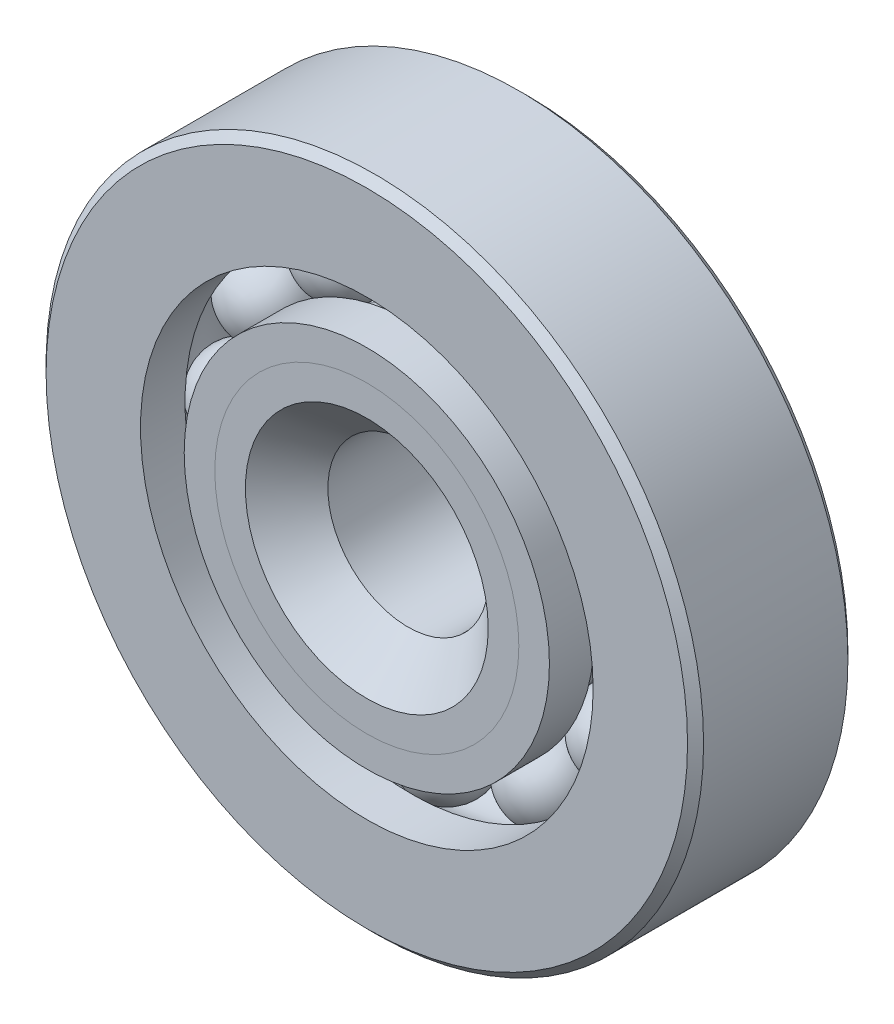
ISO-10303-21;
HEADER;
FILE_DESCRIPTION(('STEP AP214'),'2;1');
FILE_NAME('part.step','',(''),(''),'','','');
FILE_SCHEMA(('AUTOMOTIVE_DESIGN { 1 0 10303 214 1 1 1 1 }'));
ENDSEC;
DATA;
#1=APPLICATION_CONTEXT('core data for automotive mechanical design processes');
#2=APPLICATION_PROTOCOL_DEFINITION('international standard','automotive_design',2000,#1);
#3=PRODUCT_CONTEXT('',#1,'mechanical');
#4=PRODUCT('Part','Part','',(#3));
#5=PRODUCT_RELATED_PRODUCT_CATEGORY('part','',(#4));
#6=PRODUCT_DEFINITION_FORMATION('','',#4);
#7=PRODUCT_DEFINITION_CONTEXT('part definition',#1,'design');
#8=PRODUCT_DEFINITION('design','',#6,#7);
#9=PRODUCT_DEFINITION_SHAPE('','',#8);
#10=(LENGTH_UNIT() NAMED_UNIT(*) SI_UNIT(.MILLI.,.METRE.));
#11=(NAMED_UNIT(*) PLANE_ANGLE_UNIT() SI_UNIT($,.RADIAN.));
#12=(NAMED_UNIT(*) SI_UNIT($,.STERADIAN.) SOLID_ANGLE_UNIT());
#13=UNCERTAINTY_MEASURE_WITH_UNIT(LENGTH_MEASURE(1.E-05),#10,'distance_accuracy_value','');
#14=(GEOMETRIC_REPRESENTATION_CONTEXT(3) GLOBAL_UNCERTAINTY_ASSIGNED_CONTEXT((#13)) GLOBAL_UNIT_ASSIGNED_CONTEXT((#10,
#11,#12)) REPRESENTATION_CONTEXT('',''));
#15=CARTESIAN_POINT('',(0.,0.,0.));
#16=DIRECTION('',(0.,0.,1.));
#17=DIRECTION('',(1.,0.,0.));
#18=AXIS2_PLACEMENT_3D('',#15,#16,#17);
#19=CARTESIAN_POINT('',(-5.06015624999989,8.76444771923727,0.));
#20=DIRECTION('',(0.,0.,1.));
#21=DIRECTION('',(-0.499999999999989,0.866025403784445,0.));
#22=AXIS2_PLACEMENT_3D('',#19,#20,#21);
#23=SPHERICAL_SURFACE('',#22,2.06909359612658);
#24=CARTESIAN_POINT('',(-5.06015624999989,8.76444771923727,2.06909359612657));
#25=VERTEX_POINT('',#24);
#26=VERTEX_LOOP('',#25);
#27=FACE_BOUND('',#26,.T.);
#28=ADVANCED_FACE('F38',(#27),#23,.T.);
#29=CLOSED_SHELL('',(#28));
#30=MANIFOLD_SOLID_BREP('B2',#29);
#31=CARTESIAN_POINT('',(-8.76444771923714,5.0601562500001,0.));
#32=DIRECTION('',(0.,0.,1.));
#33=DIRECTION('',(-0.866025403784433,0.50000000000001,0.));
#34=AXIS2_PLACEMENT_3D('',#31,#32,#33);
#35=SPHERICAL_SURFACE('',#34,2.06909359612658);
#36=CARTESIAN_POINT('',(-8.76444771923714,5.0601562500001,2.06909359612657));
#37=VERTEX_POINT('',#36);
#38=VERTEX_LOOP('',#37);
#39=FACE_BOUND('',#38,.T.);
#40=ADVANCED_FACE('F69',(#39),#35,.T.);
#41=CLOSED_SHELL('',(#40));
#42=MANIFOLD_SOLID_BREP('B6',#41);
#43=CARTESIAN_POINT('',(-10.1203125,1.06004646711033E-13,0.));
#44=DIRECTION('',(0.,0.,1.));
#45=DIRECTION('',(-1.,0.,0.));
#46=AXIS2_PLACEMENT_3D('',#43,#44,#45);
#47=SPHERICAL_SURFACE('',#46,2.06909359612658);
#48=CARTESIAN_POINT('',(-10.1203125,1.06004646711033E-13,2.06909359612657));
#49=VERTEX_POINT('',#48);
#50=VERTEX_LOOP('',#49);
#51=FACE_BOUND('',#50,.T.);
#52=ADVANCED_FACE('F100',(#51),#47,.T.);
#53=CLOSED_SHELL('',(#52));
#54=MANIFOLD_SOLID_BREP('B34',#53);
#55=CARTESIAN_POINT('',(-8.76444771923725,-5.06015624999992,0.));
#56=DIRECTION('',(0.,0.,1.));
#57=DIRECTION('',(-0.866025403784443,-0.499999999999992,0.));
#58=AXIS2_PLACEMENT_3D('',#55,#56,#57);
#59=SPHERICAL_SURFACE('',#58,2.06909359612658);
#60=CARTESIAN_POINT('',(-8.76444771923725,-5.06015624999992,2.06909359612657));
#61=VERTEX_POINT('',#60);
#62=VERTEX_LOOP('',#61);
#63=FACE_BOUND('',#62,.T.);
#64=ADVANCED_FACE('F131',(#63),#59,.T.);
#65=CLOSED_SHELL('',(#64));
#66=MANIFOLD_SOLID_BREP('B65',#65);
#67=CARTESIAN_POINT('',(-5.06015625000007,-8.76444771923716,0.));
#68=DIRECTION('',(0.,0.,1.));
#69=DIRECTION('',(-0.500000000000007,-0.866025403784435,0.));
#70=AXIS2_PLACEMENT_3D('',#67,#68,#69);
#71=SPHERICAL_SURFACE('',#70,2.06909359612658);
#72=CARTESIAN_POINT('',(-5.06015625000007,-8.76444771923716,2.06909359612657));
#73=VERTEX_POINT('',#72);
#74=VERTEX_LOOP('',#73);
#75=FACE_BOUND('',#74,.T.);
#76=ADVANCED_FACE('F162',(#75),#71,.T.);
#77=CLOSED_SHELL('',(#76));
#78=MANIFOLD_SOLID_BREP('B96',#77);
#79=CARTESIAN_POINT('',(0.,-10.1203125,0.));
#80=DIRECTION('',(0.,0.,1.));
#81=DIRECTION('',(0.,-1.,0.));
#82=AXIS2_PLACEMENT_3D('',#79,#80,#81);
#83=SPHERICAL_SURFACE('',#82,2.06909359612658);
#84=CARTESIAN_POINT('',(0.,-10.1203125,2.06909359612657));
#85=VERTEX_POINT('',#84);
#86=VERTEX_LOOP('',#85);
#87=FACE_BOUND('',#86,.T.);
#88=ADVANCED_FACE('F193',(#87),#83,.T.);
#89=CLOSED_SHELL('',(#88));
#90=MANIFOLD_SOLID_BREP('B127',#89);
#91=CARTESIAN_POINT('',(5.06015624999995,-8.76444771923723,0.));
#92=DIRECTION('',(0.,0.,1.));
#93=DIRECTION('',(0.499999999999995,-0.866025403784442,0.));
#94=AXIS2_PLACEMENT_3D('',#91,#92,#93);
#95=SPHERICAL_SURFACE('',#94,2.06909359612658);
#96=CARTESIAN_POINT('',(5.06015624999995,-8.76444771923723,2.06909359612657));
#97=VERTEX_POINT('',#96);
#98=VERTEX_LOOP('',#97);
#99=FACE_BOUND('',#98,.T.);
#100=ADVANCED_FACE('F224',(#99),#95,.T.);
#101=CLOSED_SHELL('',(#100));
#102=MANIFOLD_SOLID_BREP('B158',#101);
#103=CARTESIAN_POINT('',(8.76444771923718,-5.06015625000004,0.));
#104=DIRECTION('',(0.,0.,1.));
#105=DIRECTION('',(0.866025403784436,-0.500000000000004,0.));
#106=AXIS2_PLACEMENT_3D('',#103,#104,#105);
#107=SPHERICAL_SURFACE('',#106,2.06909359612658);
#108=CARTESIAN_POINT('',(8.76444771923718,-5.06015625000004,2.06909359612657));
#109=VERTEX_POINT('',#108);
#110=VERTEX_LOOP('',#109);
#111=FACE_BOUND('',#110,.T.);
#112=ADVANCED_FACE('F255',(#111),#107,.T.);
#113=CLOSED_SHELL('',(#112));
#114=MANIFOLD_SOLID_BREP('B189',#113);
#115=CARTESIAN_POINT('',(10.1203125,0.,0.));
#116=DIRECTION('',(0.,0.,1.));
#117=DIRECTION('',(1.,0.,0.));
#118=AXIS2_PLACEMENT_3D('',#115,#116,#117);
#119=SPHERICAL_SURFACE('',#118,2.06909359612658);
#120=CARTESIAN_POINT('',(10.1203125,0.,2.06909359612657));
#121=VERTEX_POINT('',#120);
#122=VERTEX_LOOP('',#121);
#123=FACE_BOUND('',#122,.T.);
#124=ADVANCED_FACE('F286',(#123),#119,.T.);
#125=CLOSED_SHELL('',(#124));
#126=MANIFOLD_SOLID_BREP('B220',#125);
#127=CARTESIAN_POINT('',(8.76444771923721,5.06015624999998,0.));
#128=DIRECTION('',(0.,0.,1.));
#129=DIRECTION('',(0.86602540378444,0.499999999999998,0.));
#130=AXIS2_PLACEMENT_3D('',#127,#128,#129);
#131=SPHERICAL_SURFACE('',#130,2.06909359612658);
#132=CARTESIAN_POINT('',(8.76444771923721,5.06015624999998,2.06909359612657));
#133=VERTEX_POINT('',#132);
#134=VERTEX_LOOP('',#133);
#135=FACE_BOUND('',#134,.T.);
#136=ADVANCED_FACE('F317',(#135),#131,.T.);
#137=CLOSED_SHELL('',(#136));
#138=MANIFOLD_SOLID_BREP('B251',#137);
#139=CARTESIAN_POINT('',(5.06015625000001,8.76444771923719,0.));
#140=DIRECTION('',(0.,0.,1.));
#141=DIRECTION('',(0.500000000000001,0.866025403784438,0.));
#142=AXIS2_PLACEMENT_3D('',#139,#140,#141);
#143=SPHERICAL_SURFACE('',#142,2.06909359612658);
#144=CARTESIAN_POINT('',(5.06015625000001,8.76444771923719,2.06909359612657));
#145=VERTEX_POINT('',#144);
#146=VERTEX_LOOP('',#145);
#147=FACE_BOUND('',#146,.T.);
#148=ADVANCED_FACE('F348',(#147),#143,.T.);
#149=CLOSED_SHELL('',(#148));
#150=MANIFOLD_SOLID_BREP('B282',#149);
#151=CARTESIAN_POINT('',(0.,10.1203125,0.));
#152=DIRECTION('',(0.,0.,1.));
#153=DIRECTION('',(0.,1.,0.));
#154=AXIS2_PLACEMENT_3D('',#151,#152,#153);
#155=SPHERICAL_SURFACE('',#154,2.06909359612658);
#156=CARTESIAN_POINT('',(0.,10.1203125,2.06909359612657));
#157=VERTEX_POINT('',#156);
#158=VERTEX_LOOP('',#157);
#159=FACE_BOUND('',#158,.T.);
#160=ADVANCED_FACE('F381',(#159),#155,.T.);
#161=CLOSED_SHELL('',(#160));
#162=MANIFOLD_SOLID_BREP('B313',#161);
#163=CARTESIAN_POINT('',(0.,7.52435177267165,3.96875));
#164=DIRECTION('',(0.,0.,-1.));
#165=DIRECTION('',(-1.,0.,0.));
#166=AXIS2_PLACEMENT_3D('',#163,#164,#165);
#167=PLANE('',#166);
#168=CARTESIAN_POINT('',(0.,0.,3.96875));
#169=DIRECTION('',(0.,0.,1.));
#170=DIRECTION('',(1.,0.,0.));
#171=AXIS2_PLACEMENT_3D('',#168,#169,#170);
#172=CIRCLE('',#171,6.00998445193671);
#173=CARTESIAN_POINT('',(6.00998445193671,0.,3.96875));
#174=VERTEX_POINT('',#173);
#175=EDGE_CURVE('E436',#174,#174,#172,.T.);
#176=ORIENTED_EDGE('',*,*,#175,.F.);
#177=EDGE_LOOP('',(#176));
#178=FACE_BOUND('',#177,.T.);
#179=CARTESIAN_POINT('',(0.,0.,3.96875));
#180=DIRECTION('',(0.,0.,1.));
#181=DIRECTION('',(1.,0.,0.));
#182=AXIS2_PLACEMENT_3D('',#179,#180,#181);
#183=CIRCLE('',#182,7.52435177267165);
#184=CARTESIAN_POINT('',(7.52435177267165,0.,3.96875));
#185=VERTEX_POINT('',#184);
#186=EDGE_CURVE('E380',#185,#185,#183,.T.);
#187=ORIENTED_EDGE('',*,*,#186,.T.);
#188=EDGE_LOOP('',(#187));
#189=FACE_BOUND('',#188,.T.);
#190=ADVANCED_FACE('F402',(#178,#189),#167,.F.);
#191=CARTESIAN_POINT('',(0.,0.,2.45438267926507));
#192=DIRECTION('',(0.,0.,1.));
#193=DIRECTION('',(1.,0.,0.));
#194=AXIS2_PLACEMENT_3D('',#191,#192,#193);
#195=CONICAL_SURFACE('',#194,6.00998445193671,0.78539816339745);
#196=ORIENTED_EDGE('',*,*,#186,.F.);
#197=EDGE_LOOP('',(#196));
#198=FACE_BOUND('',#197,.T.);
#199=CARTESIAN_POINT('',(0.,0.,2.45438267926507));
#200=DIRECTION('',(0.,0.,1.));
#201=DIRECTION('',(1.,0.,0.));
#202=AXIS2_PLACEMENT_3D('',#199,#200,#201);
#203=CIRCLE('',#202,6.00998445193671);
#204=CARTESIAN_POINT('',(6.00998445193671,0.,2.45438267926507));
#205=VERTEX_POINT('',#204);
#206=EDGE_CURVE('E408',#205,#205,#203,.T.);
#207=ORIENTED_EDGE('',*,*,#206,.T.);
#208=EDGE_LOOP('',(#207));
#209=FACE_BOUND('',#208,.T.);
#210=ADVANCED_FACE('F443',(#198,#209),#195,.T.);
#211=CARTESIAN_POINT('',(0.,0.,3.96875));
#212=DIRECTION('',(0.,0.,1.));
#213=DIRECTION('',(1.,0.,0.));
#214=AXIS2_PLACEMENT_3D('',#211,#212,#213);
#215=CYLINDRICAL_SURFACE('',#214,6.00998445193671);
#216=ORIENTED_EDGE('',*,*,#206,.F.);
#217=EDGE_LOOP('',(#216));
#218=FACE_BOUND('',#217,.T.);
#219=CARTESIAN_POINT('',(0.,0.,0.));
#220=DIRECTION('',(0.,0.,1.));
#221=DIRECTION('',(1.,0.,0.));
#222=AXIS2_PLACEMENT_3D('',#219,#220,#221);
#223=CIRCLE('',#222,6.00998445193671);
#224=CARTESIAN_POINT('',(6.00998445193671,0.,0.));
#225=VERTEX_POINT('',#224);
#226=EDGE_CURVE('E412',#225,#225,#223,.T.);
#227=ORIENTED_EDGE('',*,*,#226,.T.);
#228=EDGE_LOOP('',(#227));
#229=FACE_BOUND('',#228,.T.);
#230=ADVANCED_FACE('F447',(#218,#229),#215,.T.);
#231=CARTESIAN_POINT('',(0.,6.00998445193671,0.));
#232=DIRECTION('',(0.,0.,-1.));
#233=DIRECTION('',(-1.,0.,0.));
#234=AXIS2_PLACEMENT_3D('',#231,#232,#233);
#235=PLANE('',#234);
#236=ORIENTED_EDGE('',*,*,#226,.F.);
#237=EDGE_LOOP('',(#236));
#238=FACE_BOUND('',#237,.T.);
#239=CARTESIAN_POINT('',(0.,0.,0.));
#240=DIRECTION('',(0.,0.,1.));
#241=DIRECTION('',(1.,0.,0.));
#242=AXIS2_PLACEMENT_3D('',#239,#240,#241);
#243=CIRCLE('',#242,8.05121890387342);
#244=CARTESIAN_POINT('',(8.05121890387342,0.,0.));
#245=VERTEX_POINT('',#244);
#246=EDGE_CURVE('E416',#245,#245,#243,.T.);
#247=ORIENTED_EDGE('',*,*,#246,.T.);
#248=EDGE_LOOP('',(#247));
#249=FACE_BOUND('',#248,.T.);
#250=ADVANCED_FACE('F452',(#238,#249),#235,.F.);
#251=CARTESIAN_POINT('',(0.,0.,0.));
#252=DIRECTION('',(0.,0.,1.));
#253=DIRECTION('',(1.,0.,0.));
#254=AXIS2_PLACEMENT_3D('',#251,#252,#253);
#255=TOROIDAL_SURFACE('',#254,10.1203125,2.06909359612657);
#256=ORIENTED_EDGE('',*,*,#246,.F.);
#257=EDGE_LOOP('',(#256));
#258=FACE_BOUND('',#257,.T.);
#259=CARTESIAN_POINT('',(0.,0.,-1.76388888888889));
#260=DIRECTION('',(0.,0.,1.));
#261=DIRECTION('',(1.,0.,0.));
#262=AXIS2_PLACEMENT_3D('',#259,#260,#261);
#263=CIRCLE('',#262,9.03871909340659);
#264=CARTESIAN_POINT('',(9.03871909340659,0.,-1.76388888888889));
#265=VERTEX_POINT('',#264);
#266=EDGE_CURVE('E421',#265,#265,#263,.T.);
#267=ORIENTED_EDGE('',*,*,#266,.T.);
#268=EDGE_LOOP('',(#267));
#269=FACE_BOUND('',#268,.T.);
#270=ADVANCED_FACE('F458',(#258,#269),#255,.F.);
#271=CARTESIAN_POINT('',(0.,0.,3.96875));
#272=DIRECTION('',(0.,0.,1.));
#273=DIRECTION('',(1.,0.,0.));
#274=AXIS2_PLACEMENT_3D('',#271,#272,#273);
#275=CYLINDRICAL_SURFACE('',#274,9.03871909340659);
#276=ORIENTED_EDGE('',*,*,#266,.F.);
#277=EDGE_LOOP('',(#276));
#278=FACE_BOUND('',#277,.T.);
#279=CARTESIAN_POINT('',(0.,0.,-3.96875));
#280=DIRECTION('',(0.,0.,1.));
#281=DIRECTION('',(1.,0.,0.));
#282=AXIS2_PLACEMENT_3D('',#279,#280,#281);
#283=CIRCLE('',#282,9.03871909340659);
#284=CARTESIAN_POINT('',(9.03871909340659,0.,-3.96875));
#285=VERTEX_POINT('',#284);
#286=EDGE_CURVE('E424',#285,#285,#283,.T.);
#287=ORIENTED_EDGE('',*,*,#286,.T.);
#288=EDGE_LOOP('',(#287));
#289=FACE_BOUND('',#288,.T.);
#290=ADVANCED_FACE('F462',(#278,#289),#275,.T.);
#291=CARTESIAN_POINT('',(0.,4.365625,-3.96875));
#292=DIRECTION('',(0.,0.,1.));
#293=DIRECTION('',(1.,0.,0.));
#294=AXIS2_PLACEMENT_3D('',#291,#292,#293);
#295=PLANE('',#294);
#296=ORIENTED_EDGE('',*,*,#286,.F.);
#297=EDGE_LOOP('',(#296));
#298=FACE_BOUND('',#297,.T.);
#299=CARTESIAN_POINT('',(0.,0.,-3.96875));
#300=DIRECTION('',(0.,0.,1.));
#301=DIRECTION('',(1.,0.,0.));
#302=AXIS2_PLACEMENT_3D('',#299,#300,#301);
#303=CIRCLE('',#302,4.365625);
#304=CARTESIAN_POINT('',(4.365625,0.,-3.96875));
#305=VERTEX_POINT('',#304);
#306=EDGE_CURVE('E427',#305,#305,#303,.T.);
#307=ORIENTED_EDGE('',*,*,#306,.T.);
#308=EDGE_LOOP('',(#307));
#309=FACE_BOUND('',#308,.T.);
#310=ADVANCED_FACE('F466',(#298,#309),#295,.F.);
#311=CARTESIAN_POINT('',(0.,0.,-3.571875));
#312=DIRECTION('',(0.,0.,-1.));
#313=DIRECTION('',(-1.,0.,0.));
#314=AXIS2_PLACEMENT_3D('',#311,#312,#313);
#315=CONICAL_SURFACE('',#314,3.96875,0.785398163397446);
#316=ORIENTED_EDGE('',*,*,#306,.F.);
#317=EDGE_LOOP('',(#316));
#318=FACE_BOUND('',#317,.T.);
#319=CARTESIAN_POINT('',(0.,0.,-3.571875));
#320=DIRECTION('',(0.,0.,1.));
#321=DIRECTION('',(1.,0.,0.));
#322=AXIS2_PLACEMENT_3D('',#319,#320,#321);
#323=CIRCLE('',#322,3.96875);
#324=CARTESIAN_POINT('',(3.96875,0.,-3.571875));
#325=VERTEX_POINT('',#324);
#326=EDGE_CURVE('E430',#325,#325,#323,.T.);
#327=ORIENTED_EDGE('',*,*,#326,.T.);
#328=EDGE_LOOP('',(#327));
#329=FACE_BOUND('',#328,.T.);
#330=ADVANCED_FACE('F470',(#318,#329),#315,.F.);
#331=CARTESIAN_POINT('',(0.,0.,3.96875));
#332=DIRECTION('',(0.,0.,1.));
#333=DIRECTION('',(1.,0.,0.));
#334=AXIS2_PLACEMENT_3D('',#331,#332,#333);
#335=CYLINDRICAL_SURFACE('',#334,3.96875);
#336=ORIENTED_EDGE('',*,*,#326,.F.);
#337=EDGE_LOOP('',(#336));
#338=FACE_BOUND('',#337,.T.);
#339=CARTESIAN_POINT('',(0.,0.,1.9275155480633));
#340=DIRECTION('',(0.,0.,1.));
#341=DIRECTION('',(1.,0.,0.));
#342=AXIS2_PLACEMENT_3D('',#339,#340,#341);
#343=CIRCLE('',#342,3.96875);
#344=CARTESIAN_POINT('',(3.96875,0.,1.9275155480633));
#345=VERTEX_POINT('',#344);
#346=EDGE_CURVE('E433',#345,#345,#343,.T.);
#347=ORIENTED_EDGE('',*,*,#346,.T.);
#348=EDGE_LOOP('',(#347));
#349=FACE_BOUND('',#348,.T.);
#350=ADVANCED_FACE('F474',(#338,#349),#335,.F.);
#351=CARTESIAN_POINT('',(0.,0.,3.96875));
#352=DIRECTION('',(0.,0.,1.));
#353=DIRECTION('',(1.,0.,0.));
#354=AXIS2_PLACEMENT_3D('',#351,#352,#353);
#355=CONICAL_SURFACE('',#354,6.00998445193671,0.78539816339745);
#356=ORIENTED_EDGE('',*,*,#346,.F.);
#357=EDGE_LOOP('',(#356));
#358=FACE_BOUND('',#357,.T.);
#359=ORIENTED_EDGE('',*,*,#175,.T.);
#360=EDGE_LOOP('',(#359));
#361=FACE_BOUND('',#360,.T.);
#362=ADVANCED_FACE('F440',(#358,#361),#355,.F.);
#363=CLOSED_SHELL('',(#190,#210,#230,#250,#270,#290,#310,#330,#350,#362));
#364=MANIFOLD_SOLID_BREP('B344',#363);
#365=CARTESIAN_POINT('',(0.,9.03871909340659,3.96875));
#366=DIRECTION('',(0.,0.,-1.));
#367=DIRECTION('',(-1.,0.,0.));
#368=AXIS2_PLACEMENT_3D('',#365,#366,#367);
#369=PLANE('',#368);
#370=CARTESIAN_POINT('',(0.,0.,3.96875));
#371=DIRECTION('',(0.,0.,1.));
#372=DIRECTION('',(1.,0.,0.));
#373=AXIS2_PLACEMENT_3D('',#370,#371,#372);
#374=CIRCLE('',#373,7.52435177267165);
#375=CARTESIAN_POINT('',(7.52435177267165,0.,3.96875));
#376=VERTEX_POINT('',#375);
#377=EDGE_CURVE('E401',#376,#376,#374,.T.);
#378=ORIENTED_EDGE('',*,*,#377,.F.);
#379=EDGE_LOOP('',(#378));
#380=FACE_BOUND('',#379,.T.);
#381=CARTESIAN_POINT('',(0.,0.,3.96875));
#382=DIRECTION('',(0.,0.,1.));
#383=DIRECTION('',(1.,0.,0.));
#384=AXIS2_PLACEMENT_3D('',#381,#382,#383);
#385=CIRCLE('',#384,9.03871909340659);
#386=CARTESIAN_POINT('',(9.03871909340659,0.,3.96875));
#387=VERTEX_POINT('',#386);
#388=EDGE_CURVE('E583',#387,#387,#385,.T.);
#389=ORIENTED_EDGE('',*,*,#388,.T.);
#390=EDGE_LOOP('',(#389));
#391=FACE_BOUND('',#390,.T.);
#392=ADVANCED_FACE('F561',(#380,#391),#369,.F.);
#393=CARTESIAN_POINT('',(0.,0.,3.96875));
#394=DIRECTION('',(0.,0.,1.));
#395=DIRECTION('',(1.,0.,0.));
#396=AXIS2_PLACEMENT_3D('',#393,#394,#395);
#397=CONICAL_SURFACE('',#396,7.52435177267165,0.78539816339745);
#398=CARTESIAN_POINT('',(0.,0.,2.45438267926507));
#399=DIRECTION('',(0.,0.,1.));
#400=DIRECTION('',(1.,0.,0.));
#401=AXIS2_PLACEMENT_3D('',#398,#399,#400);
#402=CIRCLE('',#401,6.00998445193671);
#403=CARTESIAN_POINT('',(6.00998445193671,0.,2.45438267926507));
#404=VERTEX_POINT('',#403);
#405=EDGE_CURVE('E567',#404,#404,#402,.T.);
#406=ORIENTED_EDGE('',*,*,#405,.F.);
#407=EDGE_LOOP('',(#406));
#408=FACE_BOUND('',#407,.T.);
#409=ORIENTED_EDGE('',*,*,#377,.T.);
#410=EDGE_LOOP('',(#409));
#411=FACE_BOUND('',#410,.T.);
#412=ADVANCED_FACE('F608',(#408,#411),#397,.F.);
#413=CARTESIAN_POINT('',(0.,0.,3.96875));
#414=DIRECTION('',(0.,0.,1.));
#415=DIRECTION('',(1.,0.,0.));
#416=AXIS2_PLACEMENT_3D('',#413,#414,#415);
#417=CYLINDRICAL_SURFACE('',#416,6.00998445193671);
#418=CARTESIAN_POINT('',(0.,0.,0.));
#419=DIRECTION('',(0.,0.,1.));
#420=DIRECTION('',(1.,0.,0.));
#421=AXIS2_PLACEMENT_3D('',#418,#419,#420);
#422=CIRCLE('',#421,6.00998445193671);
#423=CARTESIAN_POINT('',(6.00998445193671,0.,0.));
#424=VERTEX_POINT('',#423);
#425=EDGE_CURVE('E571',#424,#424,#422,.T.);
#426=ORIENTED_EDGE('',*,*,#425,.F.);
#427=EDGE_LOOP('',(#426));
#428=FACE_BOUND('',#427,.T.);
#429=ORIENTED_EDGE('',*,*,#405,.T.);
#430=EDGE_LOOP('',(#429));
#431=FACE_BOUND('',#430,.T.);
#432=ADVANCED_FACE('F603',(#428,#431),#417,.F.);
#433=CARTESIAN_POINT('',(0.,6.00998445193671,0.));
#434=DIRECTION('',(0.,0.,1.));
#435=DIRECTION('',(1.,0.,0.));
#436=AXIS2_PLACEMENT_3D('',#433,#434,#435);
#437=PLANE('',#436);
#438=CARTESIAN_POINT('',(0.,0.,0.));
#439=DIRECTION('',(0.,0.,1.));
#440=DIRECTION('',(1.,0.,0.));
#441=AXIS2_PLACEMENT_3D('',#438,#439,#440);
#442=CIRCLE('',#441,8.05121890387342);
#443=CARTESIAN_POINT('',(8.05121890387342,0.,0.));
#444=VERTEX_POINT('',#443);
#445=EDGE_CURVE('E575',#444,#444,#442,.T.);
#446=ORIENTED_EDGE('',*,*,#445,.F.);
#447=EDGE_LOOP('',(#446));
#448=FACE_BOUND('',#447,.T.);
#449=ORIENTED_EDGE('',*,*,#425,.T.);
#450=EDGE_LOOP('',(#449));
#451=FACE_BOUND('',#450,.T.);
#452=ADVANCED_FACE('F597',(#448,#451),#437,.F.);
#453=CARTESIAN_POINT('',(0.,0.,0.));
#454=DIRECTION('',(0.,0.,1.));
#455=DIRECTION('',(1.,0.,0.));
#456=AXIS2_PLACEMENT_3D('',#453,#454,#455);
#457=TOROIDAL_SURFACE('',#456,10.1203125,2.06909359612658);
#458=CARTESIAN_POINT('',(0.,0.,1.76388888888889));
#459=DIRECTION('',(0.,0.,1.));
#460=DIRECTION('',(1.,0.,0.));
#461=AXIS2_PLACEMENT_3D('',#458,#459,#460);
#462=CIRCLE('',#461,9.03871909340659);
#463=CARTESIAN_POINT('',(9.03871909340659,0.,1.76388888888889));
#464=VERTEX_POINT('',#463);
#465=EDGE_CURVE('E580',#464,#464,#462,.T.);
#466=ORIENTED_EDGE('',*,*,#465,.F.);
#467=EDGE_LOOP('',(#466));
#468=FACE_BOUND('',#467,.T.);
#469=ORIENTED_EDGE('',*,*,#445,.T.);
#470=EDGE_LOOP('',(#469));
#471=FACE_BOUND('',#470,.T.);
#472=ADVANCED_FACE('F591',(#468,#471),#457,.F.);
#473=CARTESIAN_POINT('',(0.,0.,3.96875));
#474=DIRECTION('',(0.,0.,1.));
#475=DIRECTION('',(1.,0.,0.));
#476=AXIS2_PLACEMENT_3D('',#473,#474,#475);
#477=CYLINDRICAL_SURFACE('',#476,9.03871909340659);
#478=ORIENTED_EDGE('',*,*,#388,.F.);
#479=EDGE_LOOP('',(#478));
#480=FACE_BOUND('',#479,.T.);
#481=ORIENTED_EDGE('',*,*,#465,.T.);
#482=EDGE_LOOP('',(#481));
#483=FACE_BOUND('',#482,.T.);
#484=ADVANCED_FACE('F588',(#480,#483),#477,.T.);
#485=CLOSED_SHELL('',(#392,#412,#432,#452,#472,#484));
#486=MANIFOLD_SOLID_BREP('B375',#485);
#487=CARTESIAN_POINT('',(0.,0.,3.571875));
#488=DIRECTION('',(0.,0.,-1.));
#489=DIRECTION('',(-1.,0.,0.));
#490=AXIS2_PLACEMENT_3D('',#487,#488,#489);
#491=CONICAL_SURFACE('',#490,16.271875,0.785398163397445);
#492=CARTESIAN_POINT('',(0.,0.,3.96875));
#493=DIRECTION('',(0.,0.,1.));
#494=DIRECTION('',(1.,0.,0.));
#495=AXIS2_PLACEMENT_3D('',#492,#493,#494);
#496=CIRCLE('',#495,15.875);
#497=CARTESIAN_POINT('',(15.875,0.,3.96875));
#498=VERTEX_POINT('',#497);
#499=EDGE_CURVE('E681',#498,#498,#496,.T.);
#500=ORIENTED_EDGE('',*,*,#499,.F.);
#501=EDGE_LOOP('',(#500));
#502=FACE_BOUND('',#501,.T.);
#503=CARTESIAN_POINT('',(0.,0.,3.571875));
#504=DIRECTION('',(0.,0.,1.));
#505=DIRECTION('',(1.,0.,0.));
#506=AXIS2_PLACEMENT_3D('',#503,#504,#505);
#507=CIRCLE('',#506,16.271875);
#508=CARTESIAN_POINT('',(16.271875,0.,3.571875));
#509=VERTEX_POINT('',#508);
#510=EDGE_CURVE('E560',#509,#509,#507,.T.);
#511=ORIENTED_EDGE('',*,*,#510,.T.);
#512=EDGE_LOOP('',(#511));
#513=FACE_BOUND('',#512,.T.);
#514=ADVANCED_FACE('F653',(#502,#513),#491,.T.);
#515=CARTESIAN_POINT('',(0.,0.,3.96875));
#516=DIRECTION('',(0.,0.,1.));
#517=DIRECTION('',(1.,0.,0.));
#518=AXIS2_PLACEMENT_3D('',#515,#516,#517);
#519=CYLINDRICAL_SURFACE('',#518,16.271875);
#520=ORIENTED_EDGE('',*,*,#510,.F.);
#521=EDGE_LOOP('',(#520));
#522=FACE_BOUND('',#521,.T.);
#523=CARTESIAN_POINT('',(0.,0.,-3.571875));
#524=DIRECTION('',(0.,0.,1.));
#525=DIRECTION('',(1.,0.,0.));
#526=AXIS2_PLACEMENT_3D('',#523,#524,#525);
#527=CIRCLE('',#526,16.271875);
#528=CARTESIAN_POINT('',(16.271875,0.,-3.571875));
#529=VERTEX_POINT('',#528);
#530=EDGE_CURVE('E659',#529,#529,#527,.T.);
#531=ORIENTED_EDGE('',*,*,#530,.T.);
#532=EDGE_LOOP('',(#531));
#533=FACE_BOUND('',#532,.T.);
#534=ADVANCED_FACE('F688',(#522,#533),#519,.T.);
#535=CARTESIAN_POINT('',(0.,0.,-3.96875));
#536=DIRECTION('',(0.,0.,1.));
#537=DIRECTION('',(1.,0.,0.));
#538=AXIS2_PLACEMENT_3D('',#535,#536,#537);
#539=CONICAL_SURFACE('',#538,15.875,0.785398163397446);
#540=ORIENTED_EDGE('',*,*,#530,.F.);
#541=EDGE_LOOP('',(#540));
#542=FACE_BOUND('',#541,.T.);
#543=CARTESIAN_POINT('',(0.,0.,-3.96875));
#544=DIRECTION('',(0.,0.,1.));
#545=DIRECTION('',(1.,0.,0.));
#546=AXIS2_PLACEMENT_3D('',#543,#544,#545);
#547=CIRCLE('',#546,15.875);
#548=CARTESIAN_POINT('',(15.875,0.,-3.96875));
#549=VERTEX_POINT('',#548);
#550=EDGE_CURVE('E663',#549,#549,#547,.T.);
#551=ORIENTED_EDGE('',*,*,#550,.T.);
#552=EDGE_LOOP('',(#551));
#553=FACE_BOUND('',#552,.T.);
#554=ADVANCED_FACE('F692',(#542,#553),#539,.T.);
#555=CARTESIAN_POINT('',(0.,15.875,-3.96875));
#556=DIRECTION('',(0.,0.,1.));
#557=DIRECTION('',(1.,0.,0.));
#558=AXIS2_PLACEMENT_3D('',#555,#556,#557);
#559=PLANE('',#558);
#560=ORIENTED_EDGE('',*,*,#550,.F.);
#561=EDGE_LOOP('',(#560));
#562=FACE_BOUND('',#561,.T.);
#563=CARTESIAN_POINT('',(0.,0.,-3.96875));
#564=DIRECTION('',(0.,0.,1.));
#565=DIRECTION('',(1.,0.,0.));
#566=AXIS2_PLACEMENT_3D('',#563,#564,#565);
#567=CIRCLE('',#566,11.2019059065934);
#568=CARTESIAN_POINT('',(11.2019059065934,0.,-3.96875));
#569=VERTEX_POINT('',#568);
#570=EDGE_CURVE('E667',#569,#569,#567,.T.);
#571=ORIENTED_EDGE('',*,*,#570,.T.);
#572=EDGE_LOOP('',(#571));
#573=FACE_BOUND('',#572,.T.);
#574=ADVANCED_FACE('F697',(#562,#573),#559,.F.);
#575=CARTESIAN_POINT('',(0.,0.,3.96875));
#576=DIRECTION('',(0.,0.,1.));
#577=DIRECTION('',(1.,0.,0.));
#578=AXIS2_PLACEMENT_3D('',#575,#576,#577);
#579=CYLINDRICAL_SURFACE('',#578,11.2019059065934);
#580=ORIENTED_EDGE('',*,*,#570,.F.);
#581=EDGE_LOOP('',(#580));
#582=FACE_BOUND('',#581,.T.);
#583=CARTESIAN_POINT('',(0.,0.,-1.76388888888889));
#584=DIRECTION('',(0.,0.,1.));
#585=DIRECTION('',(1.,0.,0.));
#586=AXIS2_PLACEMENT_3D('',#583,#584,#585);
#587=CIRCLE('',#586,11.2019059065934);
#588=CARTESIAN_POINT('',(11.2019059065934,0.,-1.76388888888889));
#589=VERTEX_POINT('',#588);
#590=EDGE_CURVE('E672',#589,#589,#587,.T.);
#591=ORIENTED_EDGE('',*,*,#590,.T.);
#592=EDGE_LOOP('',(#591));
#593=FACE_BOUND('',#592,.T.);
#594=ADVANCED_FACE('F703',(#582,#593),#579,.F.);
#595=CARTESIAN_POINT('',(0.,0.,0.));
#596=DIRECTION('',(0.,0.,1.));
#597=DIRECTION('',(1.,0.,0.));
#598=AXIS2_PLACEMENT_3D('',#595,#596,#597);
#599=TOROIDAL_SURFACE('',#598,10.1203125,2.06909359612658);
#600=ORIENTED_EDGE('',*,*,#590,.F.);
#601=EDGE_LOOP('',(#600));
#602=FACE_BOUND('',#601,.T.);
#603=CARTESIAN_POINT('',(0.,0.,1.76388888888889));
#604=DIRECTION('',(0.,0.,1.));
#605=DIRECTION('',(1.,0.,0.));
#606=AXIS2_PLACEMENT_3D('',#603,#604,#605);
#607=CIRCLE('',#606,11.2019059065934);
#608=CARTESIAN_POINT('',(11.2019059065934,0.,1.76388888888889));
#609=VERTEX_POINT('',#608);
#610=EDGE_CURVE('E675',#609,#609,#607,.T.);
#611=ORIENTED_EDGE('',*,*,#610,.T.);
#612=EDGE_LOOP('',(#611));
#613=FACE_BOUND('',#612,.T.);
#614=ADVANCED_FACE('F707',(#602,#613),#599,.F.);
#615=CARTESIAN_POINT('',(0.,0.,3.96875));
#616=DIRECTION('',(0.,0.,1.));
#617=DIRECTION('',(1.,0.,0.));
#618=AXIS2_PLACEMENT_3D('',#615,#616,#617);
#619=CYLINDRICAL_SURFACE('',#618,11.2019059065934);
#620=ORIENTED_EDGE('',*,*,#610,.F.);
#621=EDGE_LOOP('',(#620));
#622=FACE_BOUND('',#621,.T.);
#623=CARTESIAN_POINT('',(0.,0.,3.96875));
#624=DIRECTION('',(0.,0.,1.));
#625=DIRECTION('',(1.,0.,0.));
#626=AXIS2_PLACEMENT_3D('',#623,#624,#625);
#627=CIRCLE('',#626,11.2019059065934);
#628=CARTESIAN_POINT('',(11.2019059065934,0.,3.96875));
#629=VERTEX_POINT('',#628);
#630=EDGE_CURVE('E678',#629,#629,#627,.T.);
#631=ORIENTED_EDGE('',*,*,#630,.T.);
#632=EDGE_LOOP('',(#631));
#633=FACE_BOUND('',#632,.T.);
#634=ADVANCED_FACE('F711',(#622,#633),#619,.F.);
#635=CARTESIAN_POINT('',(0.,15.875,3.96875));
#636=DIRECTION('',(0.,0.,-1.));
#637=DIRECTION('',(-1.,0.,0.));
#638=AXIS2_PLACEMENT_3D('',#635,#636,#637);
#639=PLANE('',#638);
#640=ORIENTED_EDGE('',*,*,#630,.F.);
#641=EDGE_LOOP('',(#640));
#642=FACE_BOUND('',#641,.T.);
#643=ORIENTED_EDGE('',*,*,#499,.T.);
#644=EDGE_LOOP('',(#643));
#645=FACE_BOUND('',#644,.T.);
#646=ADVANCED_FACE('F685',(#642,#645),#639,.F.);
#647=CLOSED_SHELL('',(#514,#534,#554,#574,#594,#614,#634,#646));
#648=MANIFOLD_SOLID_BREP('B396',#647);
#649=ADVANCED_BREP_SHAPE_REPRESENTATION('',(#18,#30,#42,#54,#66,#78,#90,#102,#114,#126,#138,
#150,#162,#364,#486,#648),#14);
#650=SHAPE_DEFINITION_REPRESENTATION(#9,#649);
ENDSEC;
END-ISO-10303-21;
